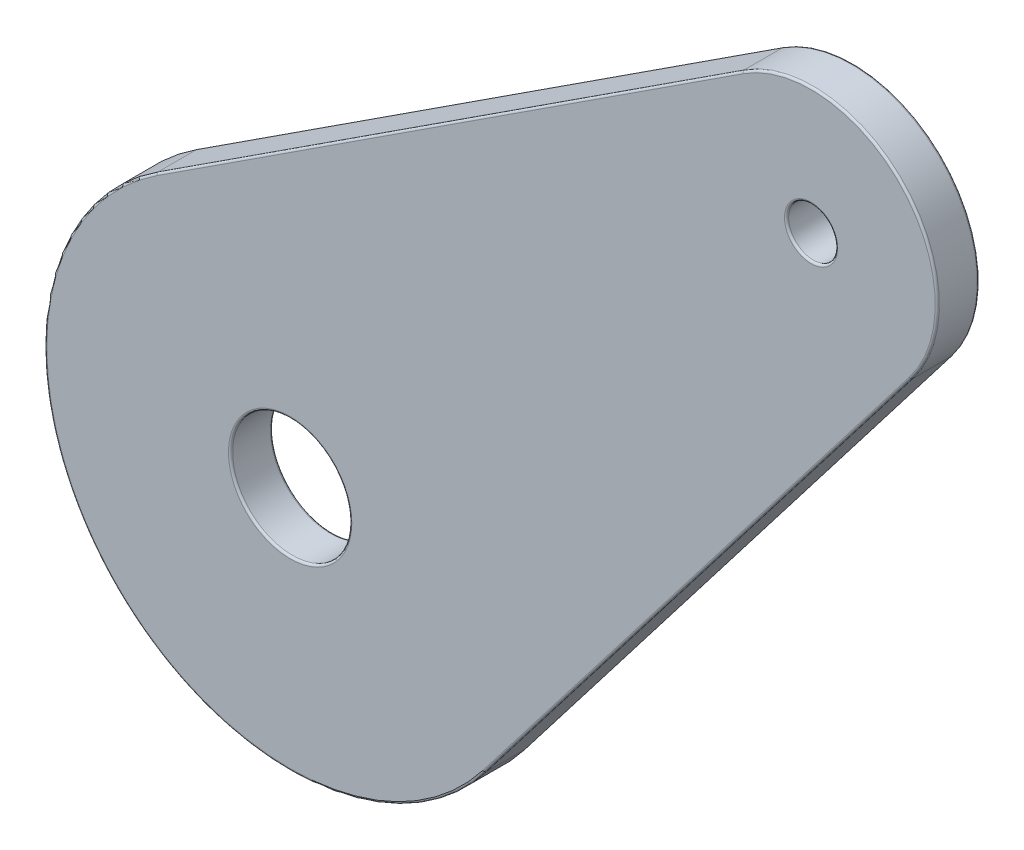
ISO-10303-21;
HEADER;
FILE_DESCRIPTION(('STEP AP214'),'2;1');
FILE_NAME('part.step','',(''),(''),'','','');
FILE_SCHEMA(('AUTOMOTIVE_DESIGN { 1 0 10303 214 1 1 1 1 }'));
ENDSEC;
DATA;
#1=APPLICATION_CONTEXT('core data for automotive mechanical design processes');
#2=APPLICATION_PROTOCOL_DEFINITION('international standard','automotive_design',2000,#1);
#3=PRODUCT_CONTEXT('',#1,'mechanical');
#4=PRODUCT('Part','Part','',(#3));
#5=PRODUCT_RELATED_PRODUCT_CATEGORY('part','',(#4));
#6=PRODUCT_DEFINITION_FORMATION('','',#4);
#7=PRODUCT_DEFINITION_CONTEXT('part definition',#1,'design');
#8=PRODUCT_DEFINITION('design','',#6,#7);
#9=PRODUCT_DEFINITION_SHAPE('','',#8);
#10=(LENGTH_UNIT() NAMED_UNIT(*) SI_UNIT(.MILLI.,.METRE.));
#11=(NAMED_UNIT(*) PLANE_ANGLE_UNIT() SI_UNIT($,.RADIAN.));
#12=(NAMED_UNIT(*) SI_UNIT($,.STERADIAN.) SOLID_ANGLE_UNIT());
#13=UNCERTAINTY_MEASURE_WITH_UNIT(LENGTH_MEASURE(1.E-05),#10,'distance_accuracy_value','');
#14=(GEOMETRIC_REPRESENTATION_CONTEXT(3) GLOBAL_UNCERTAINTY_ASSIGNED_CONTEXT((#13)) GLOBAL_UNIT_ASSIGNED_CONTEXT((#10,
#11,#12)) REPRESENTATION_CONTEXT('',''));
#15=CARTESIAN_POINT('',(0.,0.,0.));
#16=DIRECTION('',(0.,0.,1.));
#17=DIRECTION('',(1.,0.,0.));
#18=AXIS2_PLACEMENT_3D('',#15,#16,#17);
#19=CARTESIAN_POINT('',(16.930701628719,91.8875588352438,3.));
#20=DIRECTION('',(0.,0.,-1.));
#21=DIRECTION('',(-1.,0.,0.));
#22=AXIS2_PLACEMENT_3D('',#19,#20,#21);
#23=CYLINDRICAL_SURFACE('',#22,9.00000000000001);
#24=DIRECTION('',(0.,0.,-1.));
#25=VECTOR('',#24,1.);
#26=CARTESIAN_POINT('',(12.0230434718741,99.4317547112503,3.));
#27=LINE('',#26,#25);
#28=CARTESIAN_POINT('',(12.0230434718741,99.4317547112503,2.85));
#29=VERTEX_POINT('',#28);
#30=CARTESIAN_POINT('',(12.0230434718741,99.4317547112503,0.15));
#31=VERTEX_POINT('',#30);
#32=EDGE_CURVE('E207',#29,#31,#27,.T.);
#33=ORIENTED_EDGE('',*,*,#32,.F.);
#34=CARTESIAN_POINT('',(16.930701628719,91.8875588352438,2.85));
#35=DIRECTION('',(0.,0.,1.));
#36=DIRECTION('',(1.,0.,0.));
#37=AXIS2_PLACEMENT_3D('',#34,#35,#36);
#38=CIRCLE('',#37,9.00000000000001);
#39=CARTESIAN_POINT('',(24.0611404194282,86.3960342152543,2.85));
#40=VERTEX_POINT('',#39);
#41=EDGE_CURVE('E145',#29,#40,#38,.F.);
#42=ORIENTED_EDGE('',*,*,#41,.T.);
#43=DIRECTION('',(0.,0.,-1.));
#44=VECTOR('',#43,1.);
#45=CARTESIAN_POINT('',(24.0611404194282,86.3960342152543,3.));
#46=LINE('',#45,#44);
#47=CARTESIAN_POINT('',(24.0611404194282,86.3960342152543,0.15));
#48=VERTEX_POINT('',#47);
#49=EDGE_CURVE('E174',#40,#48,#46,.T.);
#50=ORIENTED_EDGE('',*,*,#49,.T.);
#51=CARTESIAN_POINT('',(16.930701628719,91.8875588352438,0.15));
#52=DIRECTION('',(0.,0.,1.));
#53=DIRECTION('',(1.,0.,0.));
#54=AXIS2_PLACEMENT_3D('',#51,#52,#53);
#55=CIRCLE('',#54,9.00000000000001);
#56=EDGE_CURVE('E143',#48,#31,#55,.T.);
#57=ORIENTED_EDGE('',*,*,#56,.T.);
#58=EDGE_LOOP('',(#33,#42,#50,#57));
#59=FACE_BOUND('',#58,.T.);
#60=ADVANCED_FACE('F35',(#59),#23,.T.);
#61=CARTESIAN_POINT('',(-41.8742991559095,64.3703992630499,3.));
#62=DIRECTION('',(-0.545295350760552,0.838243986222941,0.));
#63=DIRECTION('',(-0.838243986222941,-0.545295350760552,0.));
#64=AXIS2_PLACEMENT_3D('',#61,#62,#63);
#65=PLANE('',#64);
#66=DIRECTION('',(0.,0.,-1.));
#67=VECTOR('',#66,1.);
#68=CARTESIAN_POINT('',(-29.7626686383096,72.2492697589014,3.));
#69=LINE('',#68,#67);
#70=CARTESIAN_POINT('',(-29.7626686383096,72.2492697589014,2.85));
#71=VERTEX_POINT('',#70);
#72=CARTESIAN_POINT('',(-29.7626686383096,72.2492697589014,0.15));
#73=VERTEX_POINT('',#72);
#74=EDGE_CURVE('E202',#71,#73,#69,.T.);
#75=ORIENTED_EDGE('',*,*,#74,.F.);
#76=DIRECTION('',(0.838243986222941,0.545295350760552,0.));
#77=VECTOR('',#76,1.);
#78=CARTESIAN_POINT('',(-41.8742991559095,64.3703992630499,2.85));
#79=LINE('',#78,#77);
#80=EDGE_CURVE('E141',#71,#29,#79,.T.);
#81=ORIENTED_EDGE('',*,*,#80,.T.);
#82=ORIENTED_EDGE('',*,*,#32,.T.);
#83=DIRECTION('',(0.838243986222941,0.545295350760552,0.));
#84=VECTOR('',#83,1.);
#85=CARTESIAN_POINT('',(-29.7626686383096,72.2492697589014,0.15));
#86=LINE('',#85,#84);
#87=EDGE_CURVE('E138',#31,#73,#86,.F.);
#88=ORIENTED_EDGE('',*,*,#87,.T.);
#89=EDGE_LOOP('',(#75,#81,#82,#88));
#90=FACE_BOUND('',#89,.T.);
#91=ADVANCED_FACE('F224',(#90),#65,.T.);
#92=CARTESIAN_POINT('',(-20.22,57.58,3.));
#93=DIRECTION('',(0.,0.,-1.));
#94=DIRECTION('',(-1.,0.,0.));
#95=AXIS2_PLACEMENT_3D('',#92,#93,#94);
#96=CYLINDRICAL_SURFACE('',#95,17.4999999999999);
#97=DIRECTION('',(0.,0.,-1.));
#98=VECTOR('',#97,1.);
#99=CARTESIAN_POINT('',(-6.35525790695452,46.9020354611316,3.));
#100=LINE('',#99,#98);
#101=CARTESIAN_POINT('',(-6.35525790695452,46.9020354611316,2.85));
#102=VERTEX_POINT('',#101);
#103=CARTESIAN_POINT('',(-6.35525790695452,46.9020354611316,0.15));
#104=VERTEX_POINT('',#103);
#105=EDGE_CURVE('E197',#102,#104,#100,.T.);
#106=ORIENTED_EDGE('',*,*,#105,.F.);
#107=CARTESIAN_POINT('',(-20.22,57.58,2.85));
#108=DIRECTION('',(0.,0.,1.));
#109=DIRECTION('',(1.,0.,0.));
#110=AXIS2_PLACEMENT_3D('',#107,#108,#109);
#111=CIRCLE('',#110,17.4999999999999);
#112=EDGE_CURVE('E136',#102,#71,#111,.F.);
#113=ORIENTED_EDGE('',*,*,#112,.T.);
#114=ORIENTED_EDGE('',*,*,#74,.T.);
#115=CARTESIAN_POINT('',(-20.22,57.58,0.15));
#116=DIRECTION('',(0.,0.,1.));
#117=DIRECTION('',(1.,0.,0.));
#118=AXIS2_PLACEMENT_3D('',#115,#116,#117);
#119=CIRCLE('',#118,17.4999999999999);
#120=EDGE_CURVE('E134',#73,#104,#119,.T.);
#121=ORIENTED_EDGE('',*,*,#120,.T.);
#122=EDGE_LOOP('',(#106,#113,#114,#121));
#123=FACE_BOUND('',#122,.T.);
#124=ADVANCED_FACE('F222',(#123),#96,.T.);
#125=CARTESIAN_POINT('',(-20.22,57.58,3.));
#126=DIRECTION('',(0.,0.,-1.));
#127=DIRECTION('',(-1.,0.,0.));
#128=AXIS2_PLACEMENT_3D('',#125,#126,#127);
#129=CYLINDRICAL_SURFACE('',#128,4.25);
#130=CARTESIAN_POINT('',(-20.22,57.58,2.85));
#131=DIRECTION('',(0.,0.,1.));
#132=DIRECTION('',(1.,0.,0.));
#133=AXIS2_PLACEMENT_3D('',#130,#131,#132);
#134=CIRCLE('',#133,4.25);
#135=CARTESIAN_POINT('',(-15.97,57.58,2.85));
#136=VERTEX_POINT('',#135);
#137=EDGE_CURVE('E150',#136,#136,#134,.T.);
#138=ORIENTED_EDGE('',*,*,#137,.T.);
#139=EDGE_LOOP('',(#138));
#140=FACE_BOUND('',#139,.T.);
#141=CARTESIAN_POINT('',(-20.22,57.58,0.15));
#142=DIRECTION('',(0.,0.,1.));
#143=DIRECTION('',(1.,0.,0.));
#144=AXIS2_PLACEMENT_3D('',#141,#142,#143);
#145=CIRCLE('',#144,4.25);
#146=CARTESIAN_POINT('',(-15.97,57.58,0.15));
#147=VERTEX_POINT('',#146);
#148=EDGE_CURVE('E147',#147,#147,#145,.F.);
#149=ORIENTED_EDGE('',*,*,#148,.T.);
#150=EDGE_LOOP('',(#149));
#151=FACE_BOUND('',#150,.T.);
#152=ADVANCED_FACE('F255',(#140,#151),#129,.F.);
#153=CARTESIAN_POINT('',(16.930701628719,91.8875588352438,3.));
#154=DIRECTION('',(0.,0.,-1.));
#155=DIRECTION('',(-1.,0.,0.));
#156=AXIS2_PLACEMENT_3D('',#153,#154,#155);
#157=CYLINDRICAL_SURFACE('',#156,1.75);
#158=CARTESIAN_POINT('',(16.930701628719,91.8875588352438,2.85));
#159=DIRECTION('',(0.,0.,1.));
#160=DIRECTION('',(1.,0.,0.));
#161=AXIS2_PLACEMENT_3D('',#158,#159,#160);
#162=CIRCLE('',#161,1.75);
#163=CARTESIAN_POINT('',(18.680701628719,91.8875588352438,2.85));
#164=VERTEX_POINT('',#163);
#165=EDGE_CURVE('E156',#164,#164,#162,.T.);
#166=ORIENTED_EDGE('',*,*,#165,.T.);
#167=EDGE_LOOP('',(#166));
#168=FACE_BOUND('',#167,.T.);
#169=CARTESIAN_POINT('',(16.930701628719,91.8875588352438,0.15));
#170=DIRECTION('',(0.,0.,1.));
#171=DIRECTION('',(1.,0.,0.));
#172=AXIS2_PLACEMENT_3D('',#169,#170,#171);
#173=CIRCLE('',#172,1.75);
#174=CARTESIAN_POINT('',(18.680701628719,91.8875588352438,0.15));
#175=VERTEX_POINT('',#174);
#176=EDGE_CURVE('E153',#175,#175,#173,.F.);
#177=ORIENTED_EDGE('',*,*,#176,.T.);
#178=EDGE_LOOP('',(#177));
#179=FACE_BOUND('',#178,.T.);
#180=ADVANCED_FACE('F258',(#168,#179),#157,.F.);
#181=CARTESIAN_POINT('',(-26.6625117315886,20.5341976703535,3.));
#182=DIRECTION('',(-0.792270976745458,0.610169402221054,0.));
#183=DIRECTION('',(-0.610169402221054,-0.792270976745458,0.));
#184=AXIS2_PLACEMENT_3D('',#181,#182,#183);
#185=PLANE('',#184);
#186=ORIENTED_EDGE('',*,*,#49,.F.);
#187=DIRECTION('',(0.610169402221054,0.792270976745458,0.));
#188=VECTOR('',#187,1.);
#189=CARTESIAN_POINT('',(-6.35525790695452,46.9020354611316,2.85));
#190=LINE('',#189,#188);
#191=EDGE_CURVE('E107',#40,#102,#190,.F.);
#192=ORIENTED_EDGE('',*,*,#191,.T.);
#193=ORIENTED_EDGE('',*,*,#105,.T.);
#194=DIRECTION('',(0.610169402221054,0.792270976745458,0.));
#195=VECTOR('',#194,1.);
#196=CARTESIAN_POINT('',(-26.6625117315886,20.5341976703535,0.15));
#197=LINE('',#196,#195);
#198=EDGE_CURVE('E127',#104,#48,#197,.T.);
#199=ORIENTED_EDGE('',*,*,#198,.T.);
#200=EDGE_LOOP('',(#186,#192,#193,#199));
#201=FACE_BOUND('',#200,.T.);
#202=ADVANCED_FACE('F195',(#201),#185,.F.);
#203=CARTESIAN_POINT('',(0.,0.,3.));
#204=DIRECTION('',(0.,0.,1.));
#205=DIRECTION('',(1.,0.,0.));
#206=AXIS2_PLACEMENT_3D('',#203,#204,#205);
#207=PLANE('',#206);
#208=CARTESIAN_POINT('',(-20.22,57.58,3.));
#209=DIRECTION('',(0.,0.,1.));
#210=DIRECTION('',(1.,0.,0.));
#211=AXIS2_PLACEMENT_3D('',#208,#209,#210);
#212=CIRCLE('',#211,17.3499999999999);
#213=CARTESIAN_POINT('',(-29.6808743356955,72.123533160968,3.));
#214=VERTEX_POINT('',#213);
#215=CARTESIAN_POINT('',(-6.47409855346635,46.9935608714648,3.));
#216=VERTEX_POINT('',#215);
#217=EDGE_CURVE('E125',#214,#216,#212,.T.);
#218=ORIENTED_EDGE('',*,*,#217,.T.);
#219=DIRECTION('',(0.610169402221054,0.792270976745458,0.));
#220=VECTOR('',#219,1.);
#221=CARTESIAN_POINT('',(23.9422997729163,86.4875596255875,3.));
#222=LINE('',#221,#220);
#223=CARTESIAN_POINT('',(23.9422997729163,86.4875596255875,3.));
#224=VERTEX_POINT('',#223);
#225=EDGE_CURVE('E105',#216,#224,#222,.T.);
#226=ORIENTED_EDGE('',*,*,#225,.T.);
#227=CARTESIAN_POINT('',(16.930701628719,91.8875588352438,3.));
#228=DIRECTION('',(0.,0.,1.));
#229=DIRECTION('',(1.,0.,0.));
#230=AXIS2_PLACEMENT_3D('',#227,#228,#229);
#231=CIRCLE('',#230,8.85);
#232=CARTESIAN_POINT('',(12.1048377744882,99.3060181133168,3.));
#233=VERTEX_POINT('',#232);
#234=EDGE_CURVE('E113',#224,#233,#231,.T.);
#235=ORIENTED_EDGE('',*,*,#234,.T.);
#236=DIRECTION('',(0.838243986222941,0.545295350760552,0.));
#237=VECTOR('',#236,1.);
#238=CARTESIAN_POINT('',(-41.7925048532955,64.2446626651165,3.));
#239=LINE('',#238,#237);
#240=EDGE_CURVE('E119',#233,#214,#239,.F.);
#241=ORIENTED_EDGE('',*,*,#240,.T.);
#242=EDGE_LOOP('',(#218,#226,#235,#241));
#243=FACE_BOUND('',#242,.T.);
#244=CARTESIAN_POINT('',(-20.22,57.58,3.));
#245=DIRECTION('',(0.,0.,1.));
#246=DIRECTION('',(1.,0.,0.));
#247=AXIS2_PLACEMENT_3D('',#244,#245,#246);
#248=CIRCLE('',#247,4.4);
#249=CARTESIAN_POINT('',(-15.82,57.58,3.));
#250=VERTEX_POINT('',#249);
#251=EDGE_CURVE('E120',#250,#250,#248,.F.);
#252=ORIENTED_EDGE('',*,*,#251,.T.);
#253=EDGE_LOOP('',(#252));
#254=FACE_BOUND('',#253,.T.);
#255=CARTESIAN_POINT('',(16.930701628719,91.8875588352438,3.));
#256=DIRECTION('',(0.,0.,1.));
#257=DIRECTION('',(1.,0.,0.));
#258=AXIS2_PLACEMENT_3D('',#255,#256,#257);
#259=CIRCLE('',#258,1.9);
#260=CARTESIAN_POINT('',(18.830701628719,91.8875588352438,3.));
#261=VERTEX_POINT('',#260);
#262=EDGE_CURVE('E209',#261,#261,#259,.F.);
#263=ORIENTED_EDGE('',*,*,#262,.T.);
#264=EDGE_LOOP('',(#263));
#265=FACE_BOUND('',#264,.T.);
#266=ADVANCED_FACE('F122',(#243,#254,#265),#207,.T.);
#267=CARTESIAN_POINT('',(0.,0.,0.));
#268=DIRECTION('',(0.,0.,1.));
#269=DIRECTION('',(1.,0.,0.));
#270=AXIS2_PLACEMENT_3D('',#267,#268,#269);
#271=PLANE('',#270);
#272=CARTESIAN_POINT('',(-20.22,57.58,0.));
#273=DIRECTION('',(0.,0.,1.));
#274=DIRECTION('',(1.,0.,0.));
#275=AXIS2_PLACEMENT_3D('',#272,#273,#274);
#276=CIRCLE('',#275,17.3499999999999);
#277=CARTESIAN_POINT('',(-6.47409855346634,46.9935608714647,0.));
#278=VERTEX_POINT('',#277);
#279=CARTESIAN_POINT('',(-29.6808743356955,72.123533160968,0.));
#280=VERTEX_POINT('',#279);
#281=EDGE_CURVE('E44',#278,#280,#276,.F.);
#282=ORIENTED_EDGE('',*,*,#281,.T.);
#283=DIRECTION('',(0.838243986222941,0.545295350760552,0.));
#284=VECTOR('',#283,1.);
#285=CARTESIAN_POINT('',(12.1048377744882,99.3060181133168,0.));
#286=LINE('',#285,#284);
#287=CARTESIAN_POINT('',(12.1048377744882,99.3060181133168,0.));
#288=VERTEX_POINT('',#287);
#289=EDGE_CURVE('E11',#280,#288,#286,.T.);
#290=ORIENTED_EDGE('',*,*,#289,.T.);
#291=CARTESIAN_POINT('',(16.930701628719,91.8875588352438,0.));
#292=DIRECTION('',(0.,0.,1.));
#293=DIRECTION('',(1.,0.,0.));
#294=AXIS2_PLACEMENT_3D('',#291,#292,#293);
#295=CIRCLE('',#294,8.85);
#296=CARTESIAN_POINT('',(23.9422997729163,86.4875596255875,0.));
#297=VERTEX_POINT('',#296);
#298=EDGE_CURVE('E165',#288,#297,#295,.F.);
#299=ORIENTED_EDGE('',*,*,#298,.T.);
#300=DIRECTION('',(0.610169402221054,0.792270976745458,0.));
#301=VECTOR('',#300,1.);
#302=CARTESIAN_POINT('',(-26.7813523781004,20.6257230806867,0.));
#303=LINE('',#302,#301);
#304=EDGE_CURVE('E55',#297,#278,#303,.F.);
#305=ORIENTED_EDGE('',*,*,#304,.T.);
#306=EDGE_LOOP('',(#282,#290,#299,#305));
#307=FACE_BOUND('',#306,.T.);
#308=CARTESIAN_POINT('',(-20.22,57.58,0.));
#309=DIRECTION('',(0.,0.,1.));
#310=DIRECTION('',(1.,0.,0.));
#311=AXIS2_PLACEMENT_3D('',#308,#309,#310);
#312=CIRCLE('',#311,4.4);
#313=CARTESIAN_POINT('',(-15.82,57.58,0.));
#314=VERTEX_POINT('',#313);
#315=EDGE_CURVE('E162',#314,#314,#312,.T.);
#316=ORIENTED_EDGE('',*,*,#315,.T.);
#317=EDGE_LOOP('',(#316));
#318=FACE_BOUND('',#317,.T.);
#319=CARTESIAN_POINT('',(16.930701628719,91.8875588352438,0.));
#320=DIRECTION('',(0.,0.,1.));
#321=DIRECTION('',(1.,0.,0.));
#322=AXIS2_PLACEMENT_3D('',#319,#320,#321);
#323=CIRCLE('',#322,1.9);
#324=CARTESIAN_POINT('',(18.830701628719,91.8875588352438,0.));
#325=VERTEX_POINT('',#324);
#326=EDGE_CURVE('E159',#325,#325,#323,.T.);
#327=ORIENTED_EDGE('',*,*,#326,.T.);
#328=EDGE_LOOP('',(#327));
#329=FACE_BOUND('',#328,.T.);
#330=ADVANCED_FACE('F231',(#307,#318,#329),#271,.F.);
#331=CARTESIAN_POINT('',(-41.7925048532955,64.2446626651165,2.85));
#332=DIRECTION('',(0.838243986222941,0.545295350760552,0.));
#333=DIRECTION('',(-0.545295350760552,0.838243986222941,0.));
#334=AXIS2_PLACEMENT_3D('',#331,#332,#333);
#335=CYLINDRICAL_SURFACE('',#334,0.15);
#336=CARTESIAN_POINT('',(12.1048377744881,99.3060181133168,2.85));
#337=DIRECTION('',(0.838243986222939,0.545295350760555,0.));
#338=DIRECTION('',(-0.545295350760555,0.83824398622294,0.));
#339=AXIS2_PLACEMENT_3D('',#336,#337,#338);
#340=CIRCLE('',#339,0.15);
#341=EDGE_CURVE('E116',#29,#233,#340,.T.);
#342=ORIENTED_EDGE('',*,*,#341,.F.);
#343=ORIENTED_EDGE('',*,*,#80,.F.);
#344=CARTESIAN_POINT('',(-29.6808743356955,72.123533160968,2.85));
#345=DIRECTION('',(-0.83824398622295,-0.545295350760538,0.));
#346=DIRECTION('',(0.545295350760538,-0.83824398622295,0.));
#347=AXIS2_PLACEMENT_3D('',#344,#345,#346);
#348=CIRCLE('',#347,0.15);
#349=EDGE_CURVE('E171',#214,#71,#348,.T.);
#350=ORIENTED_EDGE('',*,*,#349,.F.);
#351=ORIENTED_EDGE('',*,*,#240,.F.);
#352=EDGE_LOOP('',(#342,#343,#350,#351));
#353=FACE_BOUND('',#352,.T.);
#354=ADVANCED_FACE('F216',(#353),#335,.T.);
#355=CARTESIAN_POINT('',(-20.22,57.58,2.85));
#356=DIRECTION('',(0.,0.,1.));
#357=DIRECTION('',(1.,0.,0.));
#358=AXIS2_PLACEMENT_3D('',#355,#356,#357);
#359=TOROIDAL_SURFACE('',#358,17.3499999999999,0.15);
#360=ORIENTED_EDGE('',*,*,#349,.T.);
#361=ORIENTED_EDGE('',*,*,#112,.F.);
#362=CARTESIAN_POINT('',(-6.47409855346635,46.9935608714648,2.85));
#363=DIRECTION('',(0.610169402221056,0.792270976745456,0.));
#364=DIRECTION('',(-0.792270976745456,0.610169402221056,0.));
#365=AXIS2_PLACEMENT_3D('',#362,#363,#364);
#366=CIRCLE('',#365,0.15);
#367=EDGE_CURVE('E110',#216,#102,#366,.T.);
#368=ORIENTED_EDGE('',*,*,#367,.F.);
#369=ORIENTED_EDGE('',*,*,#217,.F.);
#370=EDGE_LOOP('',(#360,#361,#368,#369));
#371=FACE_BOUND('',#370,.T.);
#372=ADVANCED_FACE('F219',(#371),#359,.T.);
#373=CARTESIAN_POINT('',(16.930701628719,91.8875588352438,2.85));
#374=DIRECTION('',(0.,0.,1.));
#375=DIRECTION('',(1.,0.,0.));
#376=AXIS2_PLACEMENT_3D('',#373,#374,#375);
#377=TOROIDAL_SURFACE('',#376,8.85,0.15);
#378=ORIENTED_EDGE('',*,*,#341,.T.);
#379=ORIENTED_EDGE('',*,*,#234,.F.);
#380=CARTESIAN_POINT('',(23.9422997729163,86.4875596255875,2.85));
#381=DIRECTION('',(-0.610169402221027,-0.792270976745478,0.));
#382=DIRECTION('',(0.792270976745478,-0.610169402221027,0.));
#383=AXIS2_PLACEMENT_3D('',#380,#381,#382);
#384=CIRCLE('',#383,0.15);
#385=EDGE_CURVE('E101',#40,#224,#384,.T.);
#386=ORIENTED_EDGE('',*,*,#385,.F.);
#387=ORIENTED_EDGE('',*,*,#41,.F.);
#388=EDGE_LOOP('',(#378,#379,#386,#387));
#389=FACE_BOUND('',#388,.T.);
#390=ADVANCED_FACE('F114',(#389),#377,.T.);
#391=CARTESIAN_POINT('',(-26.7813523781004,20.6257230806867,2.85));
#392=DIRECTION('',(-0.610169402221054,-0.792270976745458,0.));
#393=DIRECTION('',(0.792270976745458,-0.610169402221054,0.));
#394=AXIS2_PLACEMENT_3D('',#391,#392,#393);
#395=CYLINDRICAL_SURFACE('',#394,0.15);
#396=ORIENTED_EDGE('',*,*,#367,.T.);
#397=ORIENTED_EDGE('',*,*,#191,.F.);
#398=ORIENTED_EDGE('',*,*,#385,.T.);
#399=ORIENTED_EDGE('',*,*,#225,.F.);
#400=EDGE_LOOP('',(#396,#397,#398,#399));
#401=FACE_BOUND('',#400,.T.);
#402=ADVANCED_FACE('F103',(#401),#395,.T.);
#403=CARTESIAN_POINT('',(-20.22,57.58,2.85));
#404=DIRECTION('',(0.,0.,1.));
#405=DIRECTION('',(1.,0.,0.));
#406=AXIS2_PLACEMENT_3D('',#403,#404,#405);
#407=TOROIDAL_SURFACE('',#406,4.4,0.15);
#408=ORIENTED_EDGE('',*,*,#251,.F.);
#409=EDGE_LOOP('',(#408));
#410=FACE_BOUND('',#409,.T.);
#411=ORIENTED_EDGE('',*,*,#137,.F.);
#412=EDGE_LOOP('',(#411));
#413=FACE_BOUND('',#412,.T.);
#414=ADVANCED_FACE('F265',(#410,#413),#407,.T.);
#415=CARTESIAN_POINT('',(16.930701628719,91.8875588352438,2.85));
#416=DIRECTION('',(0.,0.,1.));
#417=DIRECTION('',(1.,0.,0.));
#418=AXIS2_PLACEMENT_3D('',#415,#416,#417);
#419=TOROIDAL_SURFACE('',#418,1.9,0.15);
#420=ORIENTED_EDGE('',*,*,#262,.F.);
#421=EDGE_LOOP('',(#420));
#422=FACE_BOUND('',#421,.T.);
#423=ORIENTED_EDGE('',*,*,#165,.F.);
#424=EDGE_LOOP('',(#423));
#425=FACE_BOUND('',#424,.T.);
#426=ADVANCED_FACE('F274',(#422,#425),#419,.T.);
#427=CARTESIAN_POINT('',(-26.7813523781004,20.6257230806867,0.15));
#428=DIRECTION('',(0.610169402221054,0.792270976745458,0.));
#429=DIRECTION('',(-0.792270976745458,0.610169402221054,0.));
#430=AXIS2_PLACEMENT_3D('',#427,#428,#429);
#431=CYLINDRICAL_SURFACE('',#430,0.15);
#432=CARTESIAN_POINT('',(23.9422997729163,86.4875596255875,0.15));
#433=DIRECTION('',(0.610169402221027,0.792270976745478,0.));
#434=DIRECTION('',(-0.792270976745478,0.610169402221027,0.));
#435=AXIS2_PLACEMENT_3D('',#432,#433,#434);
#436=CIRCLE('',#435,0.15);
#437=EDGE_CURVE('E178',#48,#297,#436,.T.);
#438=ORIENTED_EDGE('',*,*,#437,.F.);
#439=ORIENTED_EDGE('',*,*,#198,.F.);
#440=CARTESIAN_POINT('',(-6.47409855346634,46.9935608714647,0.15));
#441=DIRECTION('',(-0.610169402221045,-0.792270976745465,0.));
#442=DIRECTION('',(0.792270976745465,-0.610169402221045,0.));
#443=AXIS2_PLACEMENT_3D('',#440,#441,#442);
#444=CIRCLE('',#443,0.15);
#445=EDGE_CURVE('E39',#278,#104,#444,.T.);
#446=ORIENTED_EDGE('',*,*,#445,.F.);
#447=ORIENTED_EDGE('',*,*,#304,.F.);
#448=EDGE_LOOP('',(#438,#439,#446,#447));
#449=FACE_BOUND('',#448,.T.);
#450=ADVANCED_FACE('F190',(#449),#431,.T.);
#451=CARTESIAN_POINT('',(-20.22,57.58,0.15));
#452=DIRECTION('',(0.,0.,1.));
#453=DIRECTION('',(1.,0.,0.));
#454=AXIS2_PLACEMENT_3D('',#451,#452,#453);
#455=TOROIDAL_SURFACE('',#454,17.3499999999999,0.15);
#456=ORIENTED_EDGE('',*,*,#445,.T.);
#457=ORIENTED_EDGE('',*,*,#120,.F.);
#458=CARTESIAN_POINT('',(-29.6808743356955,72.123533160968,0.15));
#459=DIRECTION('',(0.83824398622295,0.545295350760538,0.));
#460=DIRECTION('',(-0.545295350760538,0.83824398622295,0.));
#461=AXIS2_PLACEMENT_3D('',#458,#459,#460);
#462=CIRCLE('',#461,0.15);
#463=EDGE_CURVE('E177',#280,#73,#462,.T.);
#464=ORIENTED_EDGE('',*,*,#463,.F.);
#465=ORIENTED_EDGE('',*,*,#281,.F.);
#466=EDGE_LOOP('',(#456,#457,#464,#465));
#467=FACE_BOUND('',#466,.T.);
#468=ADVANCED_FACE('F187',(#467),#455,.T.);
#469=CARTESIAN_POINT('',(16.930701628719,91.8875588352438,0.15));
#470=DIRECTION('',(0.,0.,1.));
#471=DIRECTION('',(1.,0.,0.));
#472=AXIS2_PLACEMENT_3D('',#469,#470,#471);
#473=TOROIDAL_SURFACE('',#472,8.85,0.15);
#474=ORIENTED_EDGE('',*,*,#437,.T.);
#475=ORIENTED_EDGE('',*,*,#298,.F.);
#476=CARTESIAN_POINT('',(12.1048377744882,99.3060181133168,0.15));
#477=DIRECTION('',(-0.838243986222939,-0.545295350760555,0.));
#478=DIRECTION('',(0.545295350760555,-0.83824398622294,0.));
#479=AXIS2_PLACEMENT_3D('',#476,#477,#478);
#480=CIRCLE('',#479,0.15);
#481=EDGE_CURVE('E175',#31,#288,#480,.T.);
#482=ORIENTED_EDGE('',*,*,#481,.F.);
#483=ORIENTED_EDGE('',*,*,#56,.F.);
#484=EDGE_LOOP('',(#474,#475,#482,#483));
#485=FACE_BOUND('',#484,.T.);
#486=ADVANCED_FACE('F230',(#485),#473,.T.);
#487=CARTESIAN_POINT('',(-41.7925048532955,64.2446626651165,0.15));
#488=DIRECTION('',(-0.838243986222941,-0.545295350760552,0.));
#489=DIRECTION('',(0.545295350760552,-0.838243986222941,0.));
#490=AXIS2_PLACEMENT_3D('',#487,#488,#489);
#491=CYLINDRICAL_SURFACE('',#490,0.15);
#492=ORIENTED_EDGE('',*,*,#463,.T.);
#493=ORIENTED_EDGE('',*,*,#87,.F.);
#494=ORIENTED_EDGE('',*,*,#481,.T.);
#495=ORIENTED_EDGE('',*,*,#289,.F.);
#496=EDGE_LOOP('',(#492,#493,#494,#495));
#497=FACE_BOUND('',#496,.T.);
#498=ADVANCED_FACE('F228',(#497),#491,.T.);
#499=CARTESIAN_POINT('',(-20.22,57.58,0.15));
#500=DIRECTION('',(0.,0.,1.));
#501=DIRECTION('',(1.,0.,0.));
#502=AXIS2_PLACEMENT_3D('',#499,#500,#501);
#503=TOROIDAL_SURFACE('',#502,4.4,0.15);
#504=ORIENTED_EDGE('',*,*,#148,.F.);
#505=EDGE_LOOP('',(#504));
#506=FACE_BOUND('',#505,.T.);
#507=ORIENTED_EDGE('',*,*,#315,.F.);
#508=EDGE_LOOP('',(#507));
#509=FACE_BOUND('',#508,.T.);
#510=ADVANCED_FACE('F240',(#506,#509),#503,.T.);
#511=CARTESIAN_POINT('',(16.930701628719,91.8875588352438,0.15));
#512=DIRECTION('',(0.,0.,1.));
#513=DIRECTION('',(1.,0.,0.));
#514=AXIS2_PLACEMENT_3D('',#511,#512,#513);
#515=TOROIDAL_SURFACE('',#514,1.9,0.15);
#516=ORIENTED_EDGE('',*,*,#176,.F.);
#517=EDGE_LOOP('',(#516));
#518=FACE_BOUND('',#517,.T.);
#519=ORIENTED_EDGE('',*,*,#326,.F.);
#520=EDGE_LOOP('',(#519));
#521=FACE_BOUND('',#520,.T.);
#522=ADVANCED_FACE('F37',(#518,#521),#515,.T.);
#523=CLOSED_SHELL('',(#60,#91,#124,#152,#180,#202,#266,#330,#354,#372,#390,#402,#414,#426,#450,
#468,#486,#498,#510,#522));
#524=MANIFOLD_SOLID_BREP('B2',#523);
#525=ADVANCED_BREP_SHAPE_REPRESENTATION('',(#18,#524),#14);
#526=SHAPE_DEFINITION_REPRESENTATION(#9,#525);
ENDSEC;
END-ISO-10303-21;
